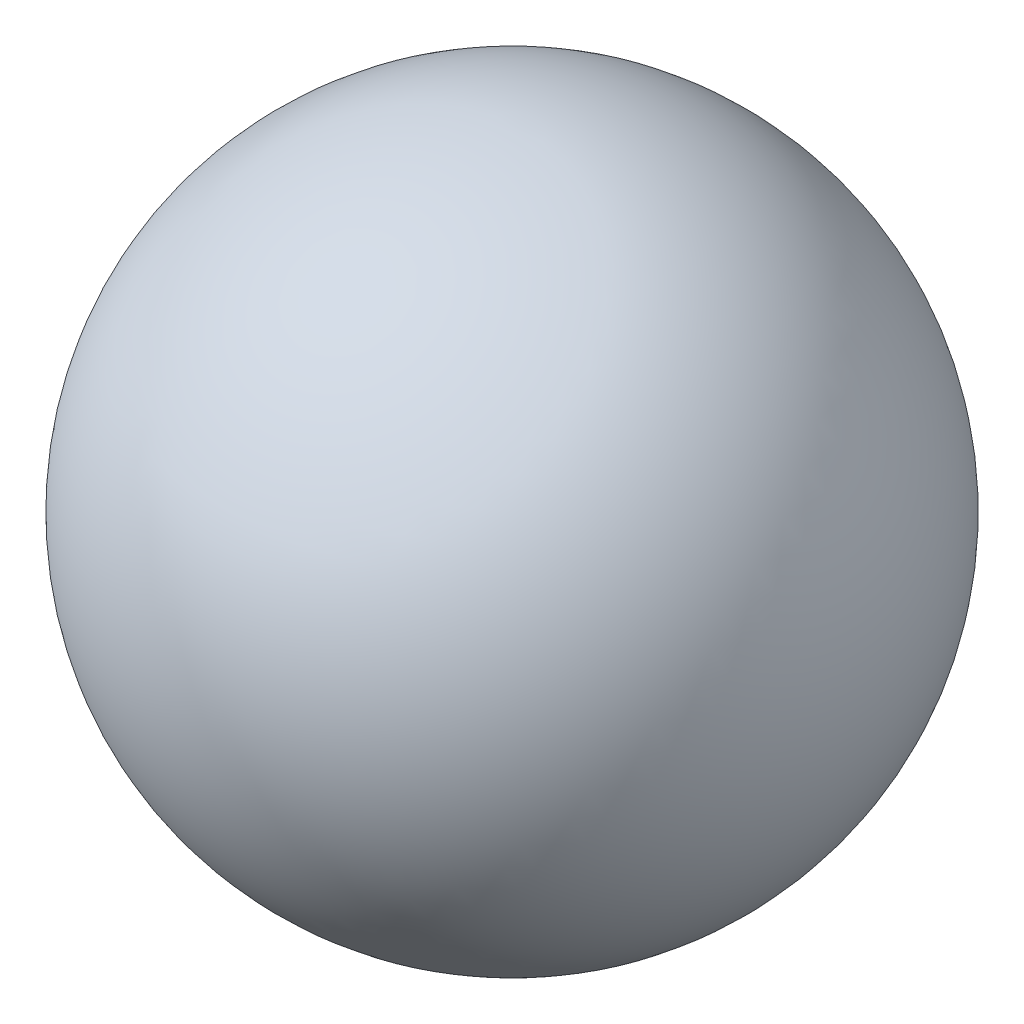
ISO-10303-21;
HEADER;
FILE_DESCRIPTION(('STEP AP214'),'2;1');
FILE_NAME('part.step','',(''),(''),'','','');
FILE_SCHEMA(('AUTOMOTIVE_DESIGN { 1 0 10303 214 1 1 1 1 }'));
ENDSEC;
DATA;
#1=APPLICATION_CONTEXT('core data for automotive mechanical design processes');
#2=APPLICATION_PROTOCOL_DEFINITION('international standard','automotive_design',2000,#1);
#3=PRODUCT_CONTEXT('',#1,'mechanical');
#4=PRODUCT('Part','Part','',(#3));
#5=PRODUCT_RELATED_PRODUCT_CATEGORY('part','',(#4));
#6=PRODUCT_DEFINITION_FORMATION('','',#4);
#7=PRODUCT_DEFINITION_CONTEXT('part definition',#1,'design');
#8=PRODUCT_DEFINITION('design','',#6,#7);
#9=PRODUCT_DEFINITION_SHAPE('','',#8);
#10=(LENGTH_UNIT() NAMED_UNIT(*) SI_UNIT(.MILLI.,.METRE.));
#11=(NAMED_UNIT(*) PLANE_ANGLE_UNIT() SI_UNIT($,.RADIAN.));
#12=(NAMED_UNIT(*) SI_UNIT($,.STERADIAN.) SOLID_ANGLE_UNIT());
#13=UNCERTAINTY_MEASURE_WITH_UNIT(LENGTH_MEASURE(1.E-05),#10,'distance_accuracy_value','');
#14=(GEOMETRIC_REPRESENTATION_CONTEXT(3) GLOBAL_UNCERTAINTY_ASSIGNED_CONTEXT((#13)) GLOBAL_UNIT_ASSIGNED_CONTEXT((#10,
#11,#12)) REPRESENTATION_CONTEXT('',''));
#15=CARTESIAN_POINT('',(0.,0.,0.));
#16=DIRECTION('',(0.,0.,1.));
#17=DIRECTION('',(1.,0.,0.));
#18=AXIS2_PLACEMENT_3D('',#15,#16,#17);
#19=CARTESIAN_POINT('',(0.,0.,0.));
#20=DIRECTION('',(0.,1.,0.));
#21=DIRECTION('',(1.,0.,0.));
#22=AXIS2_PLACEMENT_3D('',#19,#20,#21);
#23=SPHERICAL_SURFACE('',#22,28.575);
#24=CARTESIAN_POINT('',(0.,28.575,0.));
#25=VERTEX_POINT('',#24);
#26=VERTEX_LOOP('',#25);
#27=FACE_BOUND('',#26,.T.);
#28=ADVANCED_FACE('F36',(#27),#23,.T.);
#29=CLOSED_SHELL('',(#28));
#30=MANIFOLD_SOLID_BREP('B2',#29);
#31=ADVANCED_BREP_SHAPE_REPRESENTATION('',(#18,#30),#14);
#32=SHAPE_DEFINITION_REPRESENTATION(#9,#31);
ENDSEC;
END-ISO-10303-21;
